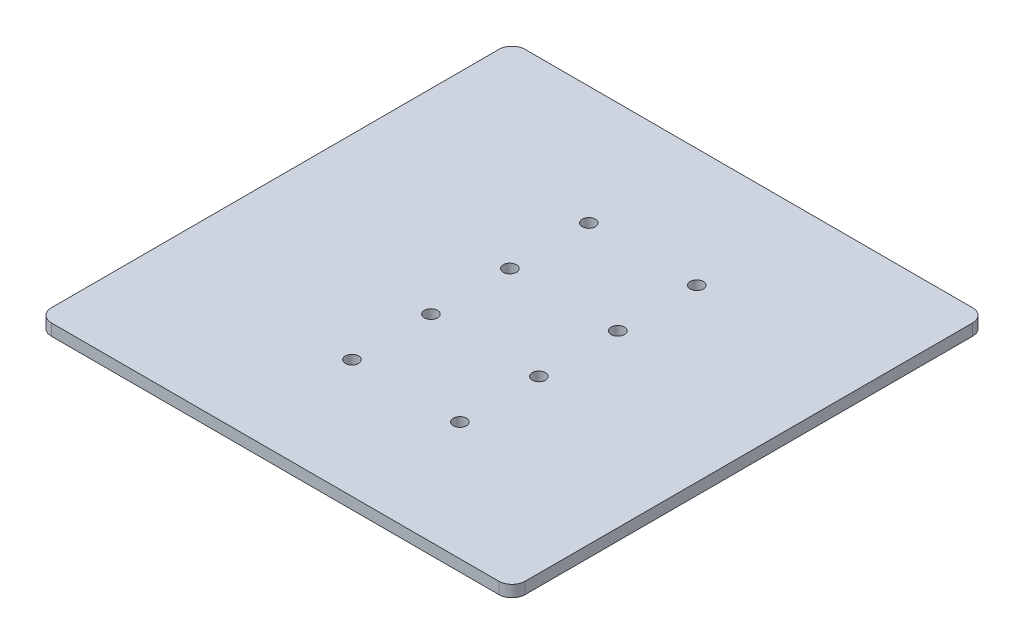
ISO-10303-21;
HEADER;
FILE_DESCRIPTION(('STEP AP214'),'2;1');
FILE_NAME('part.step','',(''),(''),'','','');
FILE_SCHEMA(('AUTOMOTIVE_DESIGN { 1 0 10303 214 1 1 1 1 }'));
ENDSEC;
DATA;
#1=APPLICATION_CONTEXT('core data for automotive mechanical design processes');
#2=APPLICATION_PROTOCOL_DEFINITION('international standard','automotive_design',2000,#1);
#3=PRODUCT_CONTEXT('',#1,'mechanical');
#4=PRODUCT('Part','Part','',(#3));
#5=PRODUCT_RELATED_PRODUCT_CATEGORY('part','',(#4));
#6=PRODUCT_DEFINITION_FORMATION('','',#4);
#7=PRODUCT_DEFINITION_CONTEXT('part definition',#1,'design');
#8=PRODUCT_DEFINITION('design','',#6,#7);
#9=PRODUCT_DEFINITION_SHAPE('','',#8);
#10=(LENGTH_UNIT() NAMED_UNIT(*) SI_UNIT(.MILLI.,.METRE.));
#11=(NAMED_UNIT(*) PLANE_ANGLE_UNIT() SI_UNIT($,.RADIAN.));
#12=(NAMED_UNIT(*) SI_UNIT($,.STERADIAN.) SOLID_ANGLE_UNIT());
#13=UNCERTAINTY_MEASURE_WITH_UNIT(LENGTH_MEASURE(1.E-05),#10,'distance_accuracy_value','');
#14=(GEOMETRIC_REPRESENTATION_CONTEXT(3) GLOBAL_UNCERTAINTY_ASSIGNED_CONTEXT((#13)) GLOBAL_UNIT_ASSIGNED_CONTEXT((#10,
#11,#12)) REPRESENTATION_CONTEXT('',''));
#15=CARTESIAN_POINT('',(0.,0.,0.));
#16=DIRECTION('',(0.,0.,1.));
#17=DIRECTION('',(1.,0.,0.));
#18=AXIS2_PLACEMENT_3D('',#15,#16,#17);
#19=CARTESIAN_POINT('',(32.004,5.588,57.15));
#20=DIRECTION('',(0.,1.,0.));
#21=DIRECTION('',(0.,0.,1.));
#22=AXIS2_PLACEMENT_3D('',#19,#20,#21);
#23=CYLINDRICAL_SURFACE('',#22,3.17499999999999);
#24=CARTESIAN_POINT('',(32.004,0.,57.15));
#25=DIRECTION('',(0.,1.,0.));
#26=DIRECTION('',(0.,0.,1.));
#27=AXIS2_PLACEMENT_3D('',#24,#25,#26);
#28=CIRCLE('',#27,3.175);
#29=CARTESIAN_POINT('',(32.004,0.,60.325));
#30=VERTEX_POINT('',#29);
#31=EDGE_CURVE('E184',#30,#30,#28,.T.);
#32=ORIENTED_EDGE('',*,*,#31,.F.);
#33=EDGE_LOOP('',(#32));
#34=FACE_BOUND('',#33,.T.);
#35=CARTESIAN_POINT('',(32.004,5.588,57.15));
#36=DIRECTION('',(0.,1.,0.));
#37=DIRECTION('',(0.,0.,1.));
#38=AXIS2_PLACEMENT_3D('',#35,#36,#37);
#39=CIRCLE('',#38,3.17499999999998);
#40=CARTESIAN_POINT('',(32.004,5.588,60.325));
#41=VERTEX_POINT('',#40);
#42=EDGE_CURVE('E188',#41,#41,#39,.T.);
#43=ORIENTED_EDGE('',*,*,#42,.T.);
#44=EDGE_LOOP('',(#43));
#45=FACE_BOUND('',#44,.T.);
#46=ADVANCED_FACE('F43',(#34,#45),#23,.F.);
#47=CARTESIAN_POINT('',(32.004,5.588,19.05));
#48=DIRECTION('',(0.,1.,0.));
#49=DIRECTION('',(0.,0.,1.));
#50=AXIS2_PLACEMENT_3D('',#47,#48,#49);
#51=CYLINDRICAL_SURFACE('',#50,3.17499999999999);
#52=CARTESIAN_POINT('',(32.004,0.,19.05));
#53=DIRECTION('',(0.,1.,0.));
#54=DIRECTION('',(0.,0.,1.));
#55=AXIS2_PLACEMENT_3D('',#52,#53,#54);
#56=CIRCLE('',#55,3.175);
#57=CARTESIAN_POINT('',(32.004,0.,22.225));
#58=VERTEX_POINT('',#57);
#59=EDGE_CURVE('E176',#58,#58,#56,.T.);
#60=ORIENTED_EDGE('',*,*,#59,.F.);
#61=EDGE_LOOP('',(#60));
#62=FACE_BOUND('',#61,.T.);
#63=CARTESIAN_POINT('',(32.004,5.588,19.05));
#64=DIRECTION('',(0.,1.,0.));
#65=DIRECTION('',(0.,0.,1.));
#66=AXIS2_PLACEMENT_3D('',#63,#64,#65);
#67=CIRCLE('',#66,3.17499999999998);
#68=CARTESIAN_POINT('',(32.004,5.588,22.225));
#69=VERTEX_POINT('',#68);
#70=EDGE_CURVE('E180',#69,#69,#67,.T.);
#71=ORIENTED_EDGE('',*,*,#70,.T.);
#72=EDGE_LOOP('',(#71));
#73=FACE_BOUND('',#72,.T.);
#74=ADVANCED_FACE('F305',(#62,#73),#51,.F.);
#75=CARTESIAN_POINT('',(-20.066,5.588,57.15));
#76=DIRECTION('',(0.,1.,0.));
#77=DIRECTION('',(0.,0.,1.));
#78=AXIS2_PLACEMENT_3D('',#75,#76,#77);
#79=CYLINDRICAL_SURFACE('',#78,3.17499999999999);
#80=CARTESIAN_POINT('',(-20.066,0.,57.15));
#81=DIRECTION('',(0.,1.,0.));
#82=DIRECTION('',(0.,0.,1.));
#83=AXIS2_PLACEMENT_3D('',#80,#81,#82);
#84=CIRCLE('',#83,3.175);
#85=CARTESIAN_POINT('',(-20.066,0.,60.325));
#86=VERTEX_POINT('',#85);
#87=EDGE_CURVE('E168',#86,#86,#84,.T.);
#88=ORIENTED_EDGE('',*,*,#87,.F.);
#89=EDGE_LOOP('',(#88));
#90=FACE_BOUND('',#89,.T.);
#91=CARTESIAN_POINT('',(-20.066,5.588,57.15));
#92=DIRECTION('',(0.,1.,0.));
#93=DIRECTION('',(0.,0.,1.));
#94=AXIS2_PLACEMENT_3D('',#91,#92,#93);
#95=CIRCLE('',#94,3.17499999999999);
#96=CARTESIAN_POINT('',(-20.066,5.588,60.325));
#97=VERTEX_POINT('',#96);
#98=EDGE_CURVE('E172',#97,#97,#95,.T.);
#99=ORIENTED_EDGE('',*,*,#98,.T.);
#100=EDGE_LOOP('',(#99));
#101=FACE_BOUND('',#100,.T.);
#102=ADVANCED_FACE('F311',(#90,#101),#79,.F.);
#103=CARTESIAN_POINT('',(-20.066,5.588,19.05));
#104=DIRECTION('',(0.,1.,0.));
#105=DIRECTION('',(0.,0.,1.));
#106=AXIS2_PLACEMENT_3D('',#103,#104,#105);
#107=CYLINDRICAL_SURFACE('',#106,3.17499999999999);
#108=CARTESIAN_POINT('',(-20.066,0.,19.05));
#109=DIRECTION('',(0.,1.,0.));
#110=DIRECTION('',(0.,0.,1.));
#111=AXIS2_PLACEMENT_3D('',#108,#109,#110);
#112=CIRCLE('',#111,3.175);
#113=CARTESIAN_POINT('',(-20.066,0.,22.225));
#114=VERTEX_POINT('',#113);
#115=EDGE_CURVE('E160',#114,#114,#112,.T.);
#116=ORIENTED_EDGE('',*,*,#115,.F.);
#117=EDGE_LOOP('',(#116));
#118=FACE_BOUND('',#117,.T.);
#119=CARTESIAN_POINT('',(-20.066,5.588,19.05));
#120=DIRECTION('',(0.,1.,0.));
#121=DIRECTION('',(0.,0.,1.));
#122=AXIS2_PLACEMENT_3D('',#119,#120,#121);
#123=CIRCLE('',#122,3.17499999999999);
#124=CARTESIAN_POINT('',(-20.066,5.588,22.225));
#125=VERTEX_POINT('',#124);
#126=EDGE_CURVE('E164',#125,#125,#123,.T.);
#127=ORIENTED_EDGE('',*,*,#126,.T.);
#128=EDGE_LOOP('',(#127));
#129=FACE_BOUND('',#128,.T.);
#130=ADVANCED_FACE('F405',(#118,#129),#107,.F.);
#131=CARTESIAN_POINT('',(-114.3,5.588,-114.3));
#132=DIRECTION('',(1.,0.,0.));
#133=DIRECTION('',(0.,0.,-1.));
#134=AXIS2_PLACEMENT_3D('',#131,#132,#133);
#135=PLANE('',#134);
#136=DIRECTION('',(0.,0.,1.));
#137=VECTOR('',#136,1.);
#138=CARTESIAN_POINT('',(-114.3,5.588,-114.3));
#139=LINE('',#138,#137);
#140=CARTESIAN_POINT('',(-114.3,5.588,-107.95));
#141=VERTEX_POINT('',#140);
#142=CARTESIAN_POINT('',(-114.3,5.588,107.95));
#143=VERTEX_POINT('',#142);
#144=EDGE_CURVE('E131',#141,#143,#139,.T.);
#145=ORIENTED_EDGE('',*,*,#144,.F.);
#146=DIRECTION('',(0.,-1.,0.));
#147=VECTOR('',#146,1.);
#148=CARTESIAN_POINT('',(-114.3,5.588,-107.95));
#149=LINE('',#148,#147);
#150=CARTESIAN_POINT('',(-114.3,0.,-107.95));
#151=VERTEX_POINT('',#150);
#152=EDGE_CURVE('E114',#141,#151,#149,.T.);
#153=ORIENTED_EDGE('',*,*,#152,.T.);
#154=DIRECTION('',(0.,0.,1.));
#155=VECTOR('',#154,1.);
#156=CARTESIAN_POINT('',(-114.3,0.,-114.3));
#157=LINE('',#156,#155);
#158=CARTESIAN_POINT('',(-114.3,0.,107.95));
#159=VERTEX_POINT('',#158);
#160=EDGE_CURVE('E128',#151,#159,#157,.T.);
#161=ORIENTED_EDGE('',*,*,#160,.T.);
#162=DIRECTION('',(0.,-1.,0.));
#163=VECTOR('',#162,1.);
#164=CARTESIAN_POINT('',(-114.3,5.588,107.95));
#165=LINE('',#164,#163);
#166=EDGE_CURVE('E134',#159,#143,#165,.F.);
#167=ORIENTED_EDGE('',*,*,#166,.T.);
#168=EDGE_LOOP('',(#145,#153,#161,#167));
#169=FACE_BOUND('',#168,.T.);
#170=ADVANCED_FACE('F127',(#169),#135,.F.);
#171=CARTESIAN_POINT('',(114.3,5.588,114.3));
#172=DIRECTION('',(0.,0.,-1.));
#173=DIRECTION('',(-1.,0.,0.));
#174=AXIS2_PLACEMENT_3D('',#171,#172,#173);
#175=PLANE('',#174);
#176=DIRECTION('',(1.,0.,0.));
#177=VECTOR('',#176,1.);
#178=CARTESIAN_POINT('',(114.3,0.,114.3));
#179=LINE('',#178,#177);
#180=CARTESIAN_POINT('',(-107.95,0.,114.3));
#181=VERTEX_POINT('',#180);
#182=CARTESIAN_POINT('',(107.95,0.,114.3));
#183=VERTEX_POINT('',#182);
#184=EDGE_CURVE('E140',#181,#183,#179,.T.);
#185=ORIENTED_EDGE('',*,*,#184,.T.);
#186=DIRECTION('',(0.,-1.,0.));
#187=VECTOR('',#186,1.);
#188=CARTESIAN_POINT('',(107.95,5.588,114.3));
#189=LINE('',#188,#187);
#190=CARTESIAN_POINT('',(107.95,5.588,114.3));
#191=VERTEX_POINT('',#190);
#192=EDGE_CURVE('E11',#183,#191,#189,.F.);
#193=ORIENTED_EDGE('',*,*,#192,.T.);
#194=DIRECTION('',(1.,0.,0.));
#195=VECTOR('',#194,1.);
#196=CARTESIAN_POINT('',(114.3,5.588,114.3));
#197=LINE('',#196,#195);
#198=CARTESIAN_POINT('',(-107.95,5.588,114.3));
#199=VERTEX_POINT('',#198);
#200=EDGE_CURVE('E229',#199,#191,#197,.T.);
#201=ORIENTED_EDGE('',*,*,#200,.F.);
#202=DIRECTION('',(0.,-1.,0.));
#203=VECTOR('',#202,1.);
#204=CARTESIAN_POINT('',(-107.95,5.588,114.3));
#205=LINE('',#204,#203);
#206=EDGE_CURVE('E52',#199,#181,#205,.T.);
#207=ORIENTED_EDGE('',*,*,#206,.T.);
#208=EDGE_LOOP('',(#185,#193,#201,#207));
#209=FACE_BOUND('',#208,.T.);
#210=ADVANCED_FACE('F227',(#209),#175,.F.);
#211=CARTESIAN_POINT('',(114.3,5.588,-114.3));
#212=DIRECTION('',(-1.,0.,0.));
#213=DIRECTION('',(0.,0.,1.));
#214=AXIS2_PLACEMENT_3D('',#211,#212,#213);
#215=PLANE('',#214);
#216=DIRECTION('',(0.,0.,-1.));
#217=VECTOR('',#216,1.);
#218=CARTESIAN_POINT('',(114.3,0.,-114.3));
#219=LINE('',#218,#217);
#220=CARTESIAN_POINT('',(114.3,0.,107.95));
#221=VERTEX_POINT('',#220);
#222=CARTESIAN_POINT('',(114.3,0.,-107.95));
#223=VERTEX_POINT('',#222);
#224=EDGE_CURVE('E146',#221,#223,#219,.T.);
#225=ORIENTED_EDGE('',*,*,#224,.T.);
#226=DIRECTION('',(0.,-1.,0.));
#227=VECTOR('',#226,1.);
#228=CARTESIAN_POINT('',(114.3,5.588,-107.95));
#229=LINE('',#228,#227);
#230=CARTESIAN_POINT('',(114.3,5.588,-107.95));
#231=VERTEX_POINT('',#230);
#232=EDGE_CURVE('E59',#223,#231,#229,.F.);
#233=ORIENTED_EDGE('',*,*,#232,.T.);
#234=DIRECTION('',(0.,0.,-1.));
#235=VECTOR('',#234,1.);
#236=CARTESIAN_POINT('',(114.3,5.588,-114.3));
#237=LINE('',#236,#235);
#238=CARTESIAN_POINT('',(114.3,5.588,107.95));
#239=VERTEX_POINT('',#238);
#240=EDGE_CURVE('E237',#239,#231,#237,.T.);
#241=ORIENTED_EDGE('',*,*,#240,.F.);
#242=DIRECTION('',(0.,-1.,0.));
#243=VECTOR('',#242,1.);
#244=CARTESIAN_POINT('',(114.3,5.588,107.95));
#245=LINE('',#244,#243);
#246=EDGE_CURVE('E217',#239,#221,#245,.T.);
#247=ORIENTED_EDGE('',*,*,#246,.T.);
#248=EDGE_LOOP('',(#225,#233,#241,#247));
#249=FACE_BOUND('',#248,.T.);
#250=ADVANCED_FACE('F236',(#249),#215,.F.);
#251=CARTESIAN_POINT('',(114.3,5.588,-114.3));
#252=DIRECTION('',(0.,0.,1.));
#253=DIRECTION('',(1.,0.,0.));
#254=AXIS2_PLACEMENT_3D('',#251,#252,#253);
#255=PLANE('',#254);
#256=DIRECTION('',(-1.,0.,0.));
#257=VECTOR('',#256,1.);
#258=CARTESIAN_POINT('',(114.3,0.,-114.3));
#259=LINE('',#258,#257);
#260=CARTESIAN_POINT('',(107.95,0.,-114.3));
#261=VERTEX_POINT('',#260);
#262=CARTESIAN_POINT('',(-107.95,0.,-114.3));
#263=VERTEX_POINT('',#262);
#264=EDGE_CURVE('E157',#261,#263,#259,.T.);
#265=ORIENTED_EDGE('',*,*,#264,.T.);
#266=DIRECTION('',(0.,-1.,0.));
#267=VECTOR('',#266,1.);
#268=CARTESIAN_POINT('',(-107.95,5.588,-114.3));
#269=LINE('',#268,#267);
#270=CARTESIAN_POINT('',(-107.95,5.588,-114.3));
#271=VERTEX_POINT('',#270);
#272=EDGE_CURVE('E115',#263,#271,#269,.F.);
#273=ORIENTED_EDGE('',*,*,#272,.T.);
#274=DIRECTION('',(-1.,0.,0.));
#275=VECTOR('',#274,1.);
#276=CARTESIAN_POINT('',(114.3,5.588,-114.3));
#277=LINE('',#276,#275);
#278=CARTESIAN_POINT('',(107.95,5.588,-114.3));
#279=VERTEX_POINT('',#278);
#280=EDGE_CURVE('E152',#279,#271,#277,.T.);
#281=ORIENTED_EDGE('',*,*,#280,.F.);
#282=DIRECTION('',(0.,-1.,0.));
#283=VECTOR('',#282,1.);
#284=CARTESIAN_POINT('',(107.95,5.588,-114.3));
#285=LINE('',#284,#283);
#286=EDGE_CURVE('E121',#279,#261,#285,.T.);
#287=ORIENTED_EDGE('',*,*,#286,.T.);
#288=EDGE_LOOP('',(#265,#273,#281,#287));
#289=FACE_BOUND('',#288,.T.);
#290=ADVANCED_FACE('F287',(#289),#255,.F.);
#291=CARTESIAN_POINT('',(0.,5.588,0.));
#292=DIRECTION('',(0.,-1.,0.));
#293=DIRECTION('',(0.,0.,-1.));
#294=AXIS2_PLACEMENT_3D('',#291,#292,#293);
#295=PLANE('',#294);
#296=CARTESIAN_POINT('',(32.004,5.588,-19.05));
#297=DIRECTION('',(0.,1.,0.));
#298=DIRECTION('',(0.,0.,1.));
#299=AXIS2_PLACEMENT_3D('',#296,#297,#298);
#300=CIRCLE('',#299,3.17499999999998);
#301=CARTESIAN_POINT('',(32.004,5.588,-15.875));
#302=VERTEX_POINT('',#301);
#303=EDGE_CURVE('E266',#302,#302,#300,.T.);
#304=ORIENTED_EDGE('',*,*,#303,.F.);
#305=EDGE_LOOP('',(#304));
#306=FACE_BOUND('',#305,.T.);
#307=CARTESIAN_POINT('',(-20.066,5.588,-19.05));
#308=DIRECTION('',(0.,1.,0.));
#309=DIRECTION('',(0.,0.,1.));
#310=AXIS2_PLACEMENT_3D('',#307,#308,#309);
#311=CIRCLE('',#310,3.17499999999999);
#312=CARTESIAN_POINT('',(-20.066,5.588,-15.875));
#313=VERTEX_POINT('',#312);
#314=EDGE_CURVE('E258',#313,#313,#311,.T.);
#315=ORIENTED_EDGE('',*,*,#314,.F.);
#316=EDGE_LOOP('',(#315));
#317=FACE_BOUND('',#316,.T.);
#318=CARTESIAN_POINT('',(-20.066,5.588,-57.15));
#319=DIRECTION('',(0.,1.,0.));
#320=DIRECTION('',(0.,0.,1.));
#321=AXIS2_PLACEMENT_3D('',#318,#319,#320);
#322=CIRCLE('',#321,3.17499999999999);
#323=CARTESIAN_POINT('',(-20.066,5.588,-53.975));
#324=VERTEX_POINT('',#323);
#325=EDGE_CURVE('E254',#324,#324,#322,.T.);
#326=ORIENTED_EDGE('',*,*,#325,.F.);
#327=EDGE_LOOP('',(#326));
#328=FACE_BOUND('',#327,.T.);
#329=CARTESIAN_POINT('',(32.004,5.588,-57.15));
#330=DIRECTION('',(0.,1.,0.));
#331=DIRECTION('',(0.,0.,1.));
#332=AXIS2_PLACEMENT_3D('',#329,#330,#331);
#333=CIRCLE('',#332,3.17499999999998);
#334=CARTESIAN_POINT('',(32.004,5.588,-53.975));
#335=VERTEX_POINT('',#334);
#336=EDGE_CURVE('E149',#335,#335,#333,.T.);
#337=ORIENTED_EDGE('',*,*,#336,.F.);
#338=EDGE_LOOP('',(#337));
#339=FACE_BOUND('',#338,.T.);
#340=ORIENTED_EDGE('',*,*,#280,.T.);
#341=CARTESIAN_POINT('',(-107.95,5.588,-107.95));
#342=DIRECTION('',(0.,-1.,0.));
#343=DIRECTION('',(0.,0.,-1.));
#344=AXIS2_PLACEMENT_3D('',#341,#342,#343);
#345=CIRCLE('',#344,6.35);
#346=EDGE_CURVE('E214',#271,#141,#345,.F.);
#347=ORIENTED_EDGE('',*,*,#346,.T.);
#348=ORIENTED_EDGE('',*,*,#144,.T.);
#349=CARTESIAN_POINT('',(-107.95,5.588,107.95));
#350=DIRECTION('',(0.,-1.,0.));
#351=DIRECTION('',(0.,0.,-1.));
#352=AXIS2_PLACEMENT_3D('',#349,#350,#351);
#353=CIRCLE('',#352,6.35);
#354=EDGE_CURVE('E206',#143,#199,#353,.F.);
#355=ORIENTED_EDGE('',*,*,#354,.T.);
#356=ORIENTED_EDGE('',*,*,#200,.T.);
#357=CARTESIAN_POINT('',(107.95,5.588,107.95));
#358=DIRECTION('',(0.,-1.,0.));
#359=DIRECTION('',(0.,0.,-1.));
#360=AXIS2_PLACEMENT_3D('',#357,#358,#359);
#361=CIRCLE('',#360,6.35);
#362=EDGE_CURVE('E66',#191,#239,#361,.F.);
#363=ORIENTED_EDGE('',*,*,#362,.T.);
#364=ORIENTED_EDGE('',*,*,#240,.T.);
#365=CARTESIAN_POINT('',(107.95,5.588,-107.95));
#366=DIRECTION('',(0.,-1.,0.));
#367=DIRECTION('',(0.,0.,-1.));
#368=AXIS2_PLACEMENT_3D('',#365,#366,#367);
#369=CIRCLE('',#368,6.35);
#370=EDGE_CURVE('E211',#231,#279,#369,.F.);
#371=ORIENTED_EDGE('',*,*,#370,.T.);
#372=EDGE_LOOP('',(#340,#347,#348,#355,#356,#363,#364,#371));
#373=FACE_BOUND('',#372,.T.);
#374=ORIENTED_EDGE('',*,*,#126,.F.);
#375=EDGE_LOOP('',(#374));
#376=FACE_BOUND('',#375,.T.);
#377=ORIENTED_EDGE('',*,*,#98,.F.);
#378=EDGE_LOOP('',(#377));
#379=FACE_BOUND('',#378,.T.);
#380=ORIENTED_EDGE('',*,*,#70,.F.);
#381=EDGE_LOOP('',(#380));
#382=FACE_BOUND('',#381,.T.);
#383=ORIENTED_EDGE('',*,*,#42,.F.);
#384=EDGE_LOOP('',(#383));
#385=FACE_BOUND('',#384,.T.);
#386=ADVANCED_FACE('F284',(#306,#317,#328,#339,#373,#376,#379,#382,#385),#295,.F.);
#387=CARTESIAN_POINT('',(0.,0.,0.));
#388=DIRECTION('',(0.,-1.,0.));
#389=DIRECTION('',(0.,0.,-1.));
#390=AXIS2_PLACEMENT_3D('',#387,#388,#389);
#391=PLANE('',#390);
#392=CARTESIAN_POINT('',(32.004,0.,-19.05));
#393=DIRECTION('',(0.,1.,0.));
#394=DIRECTION('',(0.,0.,1.));
#395=AXIS2_PLACEMENT_3D('',#392,#393,#394);
#396=CIRCLE('',#395,3.175);
#397=CARTESIAN_POINT('',(32.004,0.,-15.875));
#398=VERTEX_POINT('',#397);
#399=EDGE_CURVE('E270',#398,#398,#396,.T.);
#400=ORIENTED_EDGE('',*,*,#399,.T.);
#401=EDGE_LOOP('',(#400));
#402=FACE_BOUND('',#401,.T.);
#403=CARTESIAN_POINT('',(-20.066,0.,-19.05));
#404=DIRECTION('',(0.,1.,0.));
#405=DIRECTION('',(0.,0.,1.));
#406=AXIS2_PLACEMENT_3D('',#403,#404,#405);
#407=CIRCLE('',#406,3.175);
#408=CARTESIAN_POINT('',(-20.066,0.,-15.875));
#409=VERTEX_POINT('',#408);
#410=EDGE_CURVE('E262',#409,#409,#407,.T.);
#411=ORIENTED_EDGE('',*,*,#410,.T.);
#412=EDGE_LOOP('',(#411));
#413=FACE_BOUND('',#412,.T.);
#414=CARTESIAN_POINT('',(-20.066,0.,-57.15));
#415=DIRECTION('',(0.,1.,0.));
#416=DIRECTION('',(0.,0.,1.));
#417=AXIS2_PLACEMENT_3D('',#414,#415,#416);
#418=CIRCLE('',#417,3.175);
#419=CARTESIAN_POINT('',(-20.066,0.,-53.975));
#420=VERTEX_POINT('',#419);
#421=EDGE_CURVE('E250',#420,#420,#418,.T.);
#422=ORIENTED_EDGE('',*,*,#421,.T.);
#423=EDGE_LOOP('',(#422));
#424=FACE_BOUND('',#423,.T.);
#425=CARTESIAN_POINT('',(32.004,0.,-57.15));
#426=DIRECTION('',(0.,1.,0.));
#427=DIRECTION('',(0.,0.,1.));
#428=AXIS2_PLACEMENT_3D('',#425,#426,#427);
#429=CIRCLE('',#428,3.175);
#430=CARTESIAN_POINT('',(32.004,0.,-53.975));
#431=VERTEX_POINT('',#430);
#432=EDGE_CURVE('E141',#431,#431,#429,.T.);
#433=ORIENTED_EDGE('',*,*,#432,.T.);
#434=EDGE_LOOP('',(#433));
#435=FACE_BOUND('',#434,.T.);
#436=ORIENTED_EDGE('',*,*,#160,.F.);
#437=CARTESIAN_POINT('',(-107.95,0.,-107.95));
#438=DIRECTION('',(0.,-1.,0.));
#439=DIRECTION('',(0.,0.,-1.));
#440=AXIS2_PLACEMENT_3D('',#437,#438,#439);
#441=CIRCLE('',#440,6.35);
#442=EDGE_CURVE('E110',#151,#263,#441,.T.);
#443=ORIENTED_EDGE('',*,*,#442,.T.);
#444=ORIENTED_EDGE('',*,*,#264,.F.);
#445=CARTESIAN_POINT('',(107.95,0.,-107.95));
#446=DIRECTION('',(0.,-1.,0.));
#447=DIRECTION('',(0.,0.,-1.));
#448=AXIS2_PLACEMENT_3D('',#445,#446,#447);
#449=CIRCLE('',#448,6.35);
#450=EDGE_CURVE('E122',#261,#223,#449,.T.);
#451=ORIENTED_EDGE('',*,*,#450,.T.);
#452=ORIENTED_EDGE('',*,*,#224,.F.);
#453=CARTESIAN_POINT('',(107.95,0.,107.95));
#454=DIRECTION('',(0.,-1.,0.));
#455=DIRECTION('',(0.,0.,-1.));
#456=AXIS2_PLACEMENT_3D('',#453,#454,#455);
#457=CIRCLE('',#456,6.35);
#458=EDGE_CURVE('E196',#221,#183,#457,.T.);
#459=ORIENTED_EDGE('',*,*,#458,.T.);
#460=ORIENTED_EDGE('',*,*,#184,.F.);
#461=CARTESIAN_POINT('',(-107.95,0.,107.95));
#462=DIRECTION('',(0.,-1.,0.));
#463=DIRECTION('',(0.,0.,-1.));
#464=AXIS2_PLACEMENT_3D('',#461,#462,#463);
#465=CIRCLE('',#464,6.35);
#466=EDGE_CURVE('E133',#181,#159,#465,.T.);
#467=ORIENTED_EDGE('',*,*,#466,.T.);
#468=EDGE_LOOP('',(#436,#443,#444,#451,#452,#459,#460,#467));
#469=FACE_BOUND('',#468,.T.);
#470=ORIENTED_EDGE('',*,*,#115,.T.);
#471=EDGE_LOOP('',(#470));
#472=FACE_BOUND('',#471,.T.);
#473=ORIENTED_EDGE('',*,*,#87,.T.);
#474=EDGE_LOOP('',(#473));
#475=FACE_BOUND('',#474,.T.);
#476=ORIENTED_EDGE('',*,*,#59,.T.);
#477=EDGE_LOOP('',(#476));
#478=FACE_BOUND('',#477,.T.);
#479=ORIENTED_EDGE('',*,*,#31,.T.);
#480=EDGE_LOOP('',(#479));
#481=FACE_BOUND('',#480,.T.);
#482=ADVANCED_FACE('F136',(#402,#413,#424,#435,#469,#472,#475,#478,#481),#391,.T.);
#483=CARTESIAN_POINT('',(32.004,5.588,-57.15));
#484=DIRECTION('',(0.,1.,0.));
#485=DIRECTION('',(0.,0.,1.));
#486=AXIS2_PLACEMENT_3D('',#483,#484,#485);
#487=CYLINDRICAL_SURFACE('',#486,3.17499999999999);
#488=ORIENTED_EDGE('',*,*,#432,.F.);
#489=EDGE_LOOP('',(#488));
#490=FACE_BOUND('',#489,.T.);
#491=ORIENTED_EDGE('',*,*,#336,.T.);
#492=EDGE_LOOP('',(#491));
#493=FACE_BOUND('',#492,.T.);
#494=ADVANCED_FACE('F358',(#490,#493),#487,.F.);
#495=CARTESIAN_POINT('',(-20.066,5.588,-57.15));
#496=DIRECTION('',(0.,1.,0.));
#497=DIRECTION('',(0.,0.,1.));
#498=AXIS2_PLACEMENT_3D('',#495,#496,#497);
#499=CYLINDRICAL_SURFACE('',#498,3.17499999999999);
#500=ORIENTED_EDGE('',*,*,#421,.F.);
#501=EDGE_LOOP('',(#500));
#502=FACE_BOUND('',#501,.T.);
#503=ORIENTED_EDGE('',*,*,#325,.T.);
#504=EDGE_LOOP('',(#503));
#505=FACE_BOUND('',#504,.T.);
#506=ADVANCED_FACE('F422',(#502,#505),#499,.F.);
#507=CARTESIAN_POINT('',(-20.066,5.588,-19.05));
#508=DIRECTION('',(0.,1.,0.));
#509=DIRECTION('',(0.,0.,1.));
#510=AXIS2_PLACEMENT_3D('',#507,#508,#509);
#511=CYLINDRICAL_SURFACE('',#510,3.17499999999999);
#512=ORIENTED_EDGE('',*,*,#410,.F.);
#513=EDGE_LOOP('',(#512));
#514=FACE_BOUND('',#513,.T.);
#515=ORIENTED_EDGE('',*,*,#314,.T.);
#516=EDGE_LOOP('',(#515));
#517=FACE_BOUND('',#516,.T.);
#518=ADVANCED_FACE('F280',(#514,#517),#511,.F.);
#519=CARTESIAN_POINT('',(32.004,5.588,-19.05));
#520=DIRECTION('',(0.,1.,0.));
#521=DIRECTION('',(0.,0.,1.));
#522=AXIS2_PLACEMENT_3D('',#519,#520,#521);
#523=CYLINDRICAL_SURFACE('',#522,3.17499999999999);
#524=ORIENTED_EDGE('',*,*,#399,.F.);
#525=EDGE_LOOP('',(#524));
#526=FACE_BOUND('',#525,.T.);
#527=ORIENTED_EDGE('',*,*,#303,.T.);
#528=EDGE_LOOP('',(#527));
#529=FACE_BOUND('',#528,.T.);
#530=ADVANCED_FACE('F277',(#526,#529),#523,.F.);
#531=CARTESIAN_POINT('',(-107.95,5.588,-107.95));
#532=DIRECTION('',(0.,-1.,0.));
#533=DIRECTION('',(0.,0.,-1.));
#534=AXIS2_PLACEMENT_3D('',#531,#532,#533);
#535=CYLINDRICAL_SURFACE('',#534,6.35);
#536=ORIENTED_EDGE('',*,*,#346,.F.);
#537=ORIENTED_EDGE('',*,*,#272,.F.);
#538=ORIENTED_EDGE('',*,*,#442,.F.);
#539=ORIENTED_EDGE('',*,*,#152,.F.);
#540=EDGE_LOOP('',(#536,#537,#538,#539));
#541=FACE_BOUND('',#540,.T.);
#542=ADVANCED_FACE('F113',(#541),#535,.T.);
#543=CARTESIAN_POINT('',(107.95,5.588,-107.95));
#544=DIRECTION('',(0.,-1.,0.));
#545=DIRECTION('',(0.,0.,-1.));
#546=AXIS2_PLACEMENT_3D('',#543,#544,#545);
#547=CYLINDRICAL_SURFACE('',#546,6.35);
#548=ORIENTED_EDGE('',*,*,#370,.F.);
#549=ORIENTED_EDGE('',*,*,#232,.F.);
#550=ORIENTED_EDGE('',*,*,#450,.F.);
#551=ORIENTED_EDGE('',*,*,#286,.F.);
#552=EDGE_LOOP('',(#548,#549,#550,#551));
#553=FACE_BOUND('',#552,.T.);
#554=ADVANCED_FACE('F319',(#553),#547,.T.);
#555=CARTESIAN_POINT('',(107.95,5.588,107.95));
#556=DIRECTION('',(0.,-1.,0.));
#557=DIRECTION('',(0.,0.,-1.));
#558=AXIS2_PLACEMENT_3D('',#555,#556,#557);
#559=CYLINDRICAL_SURFACE('',#558,6.35);
#560=ORIENTED_EDGE('',*,*,#362,.F.);
#561=ORIENTED_EDGE('',*,*,#192,.F.);
#562=ORIENTED_EDGE('',*,*,#458,.F.);
#563=ORIENTED_EDGE('',*,*,#246,.F.);
#564=EDGE_LOOP('',(#560,#561,#562,#563));
#565=FACE_BOUND('',#564,.T.);
#566=ADVANCED_FACE('F235',(#565),#559,.T.);
#567=CARTESIAN_POINT('',(-107.95,5.588,107.95));
#568=DIRECTION('',(0.,-1.,0.));
#569=DIRECTION('',(0.,0.,-1.));
#570=AXIS2_PLACEMENT_3D('',#567,#568,#569);
#571=CYLINDRICAL_SURFACE('',#570,6.35);
#572=ORIENTED_EDGE('',*,*,#354,.F.);
#573=ORIENTED_EDGE('',*,*,#166,.F.);
#574=ORIENTED_EDGE('',*,*,#466,.F.);
#575=ORIENTED_EDGE('',*,*,#206,.F.);
#576=EDGE_LOOP('',(#572,#573,#574,#575));
#577=FACE_BOUND('',#576,.T.);
#578=ADVANCED_FACE('F45',(#577),#571,.T.);
#579=CLOSED_SHELL('',(#46,#74,#102,#130,#170,#210,#250,#290,#386,#482,#494,#506,#518,#530,#542,
#554,#566,#578));
#580=MANIFOLD_SOLID_BREP('B2',#579);
#581=ADVANCED_BREP_SHAPE_REPRESENTATION('',(#18,#580),#14);
#582=SHAPE_DEFINITION_REPRESENTATION(#9,#581);
ENDSEC;
END-ISO-10303-21;
